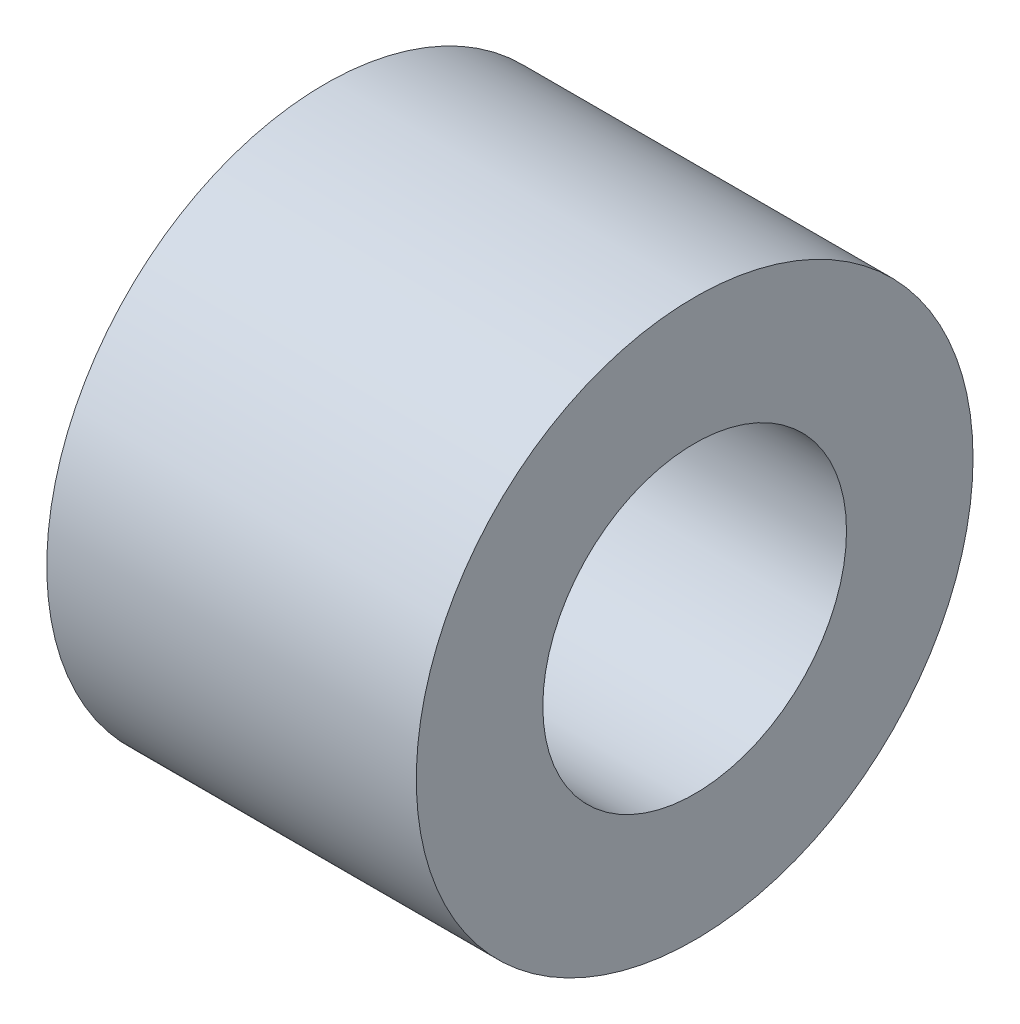
ISO-10303-21;
HEADER;
FILE_DESCRIPTION(('STEP AP214'),'2;1');
FILE_NAME('part.step','',(''),(''),'','','');
FILE_SCHEMA(('AUTOMOTIVE_DESIGN { 1 0 10303 214 1 1 1 1 }'));
ENDSEC;
DATA;
#1=APPLICATION_CONTEXT('core data for automotive mechanical design processes');
#2=APPLICATION_PROTOCOL_DEFINITION('international standard','automotive_design',2000,#1);
#3=PRODUCT_CONTEXT('',#1,'mechanical');
#4=PRODUCT('Part','Part','',(#3));
#5=PRODUCT_RELATED_PRODUCT_CATEGORY('part','',(#4));
#6=PRODUCT_DEFINITION_FORMATION('','',#4);
#7=PRODUCT_DEFINITION_CONTEXT('part definition',#1,'design');
#8=PRODUCT_DEFINITION('design','',#6,#7);
#9=PRODUCT_DEFINITION_SHAPE('','',#8);
#10=(LENGTH_UNIT() NAMED_UNIT(*) SI_UNIT(.MILLI.,.METRE.));
#11=(NAMED_UNIT(*) PLANE_ANGLE_UNIT() SI_UNIT($,.RADIAN.));
#12=(NAMED_UNIT(*) SI_UNIT($,.STERADIAN.) SOLID_ANGLE_UNIT());
#13=UNCERTAINTY_MEASURE_WITH_UNIT(LENGTH_MEASURE(1.E-05),#10,'distance_accuracy_value','');
#14=(GEOMETRIC_REPRESENTATION_CONTEXT(3) GLOBAL_UNCERTAINTY_ASSIGNED_CONTEXT((#13)) GLOBAL_UNIT_ASSIGNED_CONTEXT((#10,
#11,#12)) REPRESENTATION_CONTEXT('',''));
#15=CARTESIAN_POINT('',(0.,0.,0.));
#16=DIRECTION('',(0.,0.,1.));
#17=DIRECTION('',(1.,0.,0.));
#18=AXIS2_PLACEMENT_3D('',#15,#16,#17);
#19=CARTESIAN_POINT('',(7.3,0.,0.));
#20=DIRECTION('',(1.,0.,0.));
#21=DIRECTION('',(0.,0.,-1.));
#22=AXIS2_PLACEMENT_3D('',#19,#20,#21);
#23=PLANE('',#22);
#24=CARTESIAN_POINT('',(7.3,0.,0.));
#25=DIRECTION('',(1.,0.,0.));
#26=DIRECTION('',(0.,0.,-1.));
#27=AXIS2_PLACEMENT_3D('',#24,#25,#26);
#28=CIRCLE('',#27,5.5);
#29=CARTESIAN_POINT('',(7.3,0.,-5.5));
#30=VERTEX_POINT('',#29);
#31=EDGE_CURVE('E10',#30,#30,#28,.T.);
#32=ORIENTED_EDGE('',*,*,#31,.T.);
#33=EDGE_LOOP('',(#32));
#34=FACE_BOUND('',#33,.T.);
#35=CARTESIAN_POINT('',(7.3,0.,0.));
#36=DIRECTION('',(1.,0.,0.));
#37=DIRECTION('',(0.,0.,-1.));
#38=AXIS2_PLACEMENT_3D('',#35,#36,#37);
#39=CIRCLE('',#38,3.);
#40=CARTESIAN_POINT('',(7.3,0.,-3.));
#41=VERTEX_POINT('',#40);
#42=EDGE_CURVE('E44',#41,#41,#39,.T.);
#43=ORIENTED_EDGE('',*,*,#42,.F.);
#44=EDGE_LOOP('',(#43));
#45=FACE_BOUND('',#44,.T.);
#46=ADVANCED_FACE('F33',(#34,#45),#23,.T.);
#47=CARTESIAN_POINT('',(0.,0.,0.));
#48=DIRECTION('',(1.,0.,0.));
#49=DIRECTION('',(0.,0.,-1.));
#50=AXIS2_PLACEMENT_3D('',#47,#48,#49);
#51=PLANE('',#50);
#52=CARTESIAN_POINT('',(0.,0.,0.));
#53=DIRECTION('',(1.,0.,0.));
#54=DIRECTION('',(0.,0.,-1.));
#55=AXIS2_PLACEMENT_3D('',#52,#53,#54);
#56=CIRCLE('',#55,5.5);
#57=CARTESIAN_POINT('',(0.,0.,-5.5));
#58=VERTEX_POINT('',#57);
#59=EDGE_CURVE('E37',#58,#58,#56,.T.);
#60=ORIENTED_EDGE('',*,*,#59,.F.);
#61=EDGE_LOOP('',(#60));
#62=FACE_BOUND('',#61,.T.);
#63=CARTESIAN_POINT('',(0.,0.,0.));
#64=DIRECTION('',(1.,0.,0.));
#65=DIRECTION('',(0.,0.,-1.));
#66=AXIS2_PLACEMENT_3D('',#63,#64,#65);
#67=CIRCLE('',#66,3.);
#68=CARTESIAN_POINT('',(0.,0.,-3.));
#69=VERTEX_POINT('',#68);
#70=EDGE_CURVE('E46',#69,#69,#67,.T.);
#71=ORIENTED_EDGE('',*,*,#70,.T.);
#72=EDGE_LOOP('',(#71));
#73=FACE_BOUND('',#72,.T.);
#74=ADVANCED_FACE('F56',(#62,#73),#51,.F.);
#75=CARTESIAN_POINT('',(7.3,0.,0.));
#76=DIRECTION('',(-1.,0.,0.));
#77=DIRECTION('',(0.,0.,1.));
#78=AXIS2_PLACEMENT_3D('',#75,#76,#77);
#79=CYLINDRICAL_SURFACE('',#78,5.5);
#80=ORIENTED_EDGE('',*,*,#31,.F.);
#81=EDGE_LOOP('',(#80));
#82=FACE_BOUND('',#81,.T.);
#83=ORIENTED_EDGE('',*,*,#59,.T.);
#84=EDGE_LOOP('',(#83));
#85=FACE_BOUND('',#84,.T.);
#86=ADVANCED_FACE('F35',(#82,#85),#79,.T.);
#87=CARTESIAN_POINT('',(7.3,0.,0.));
#88=DIRECTION('',(-1.,0.,0.));
#89=DIRECTION('',(0.,0.,1.));
#90=AXIS2_PLACEMENT_3D('',#87,#88,#89);
#91=CYLINDRICAL_SURFACE('',#90,3.);
#92=ORIENTED_EDGE('',*,*,#42,.T.);
#93=EDGE_LOOP('',(#92));
#94=FACE_BOUND('',#93,.T.);
#95=ORIENTED_EDGE('',*,*,#70,.F.);
#96=EDGE_LOOP('',(#95));
#97=FACE_BOUND('',#96,.T.);
#98=ADVANCED_FACE('F52',(#94,#97),#91,.F.);
#99=CLOSED_SHELL('',(#46,#74,#86,#98));
#100=MANIFOLD_SOLID_BREP('B2',#99);
#101=ADVANCED_BREP_SHAPE_REPRESENTATION('',(#18,#100),#14);
#102=SHAPE_DEFINITION_REPRESENTATION(#9,#101);
ENDSEC;
END-ISO-10303-21;
